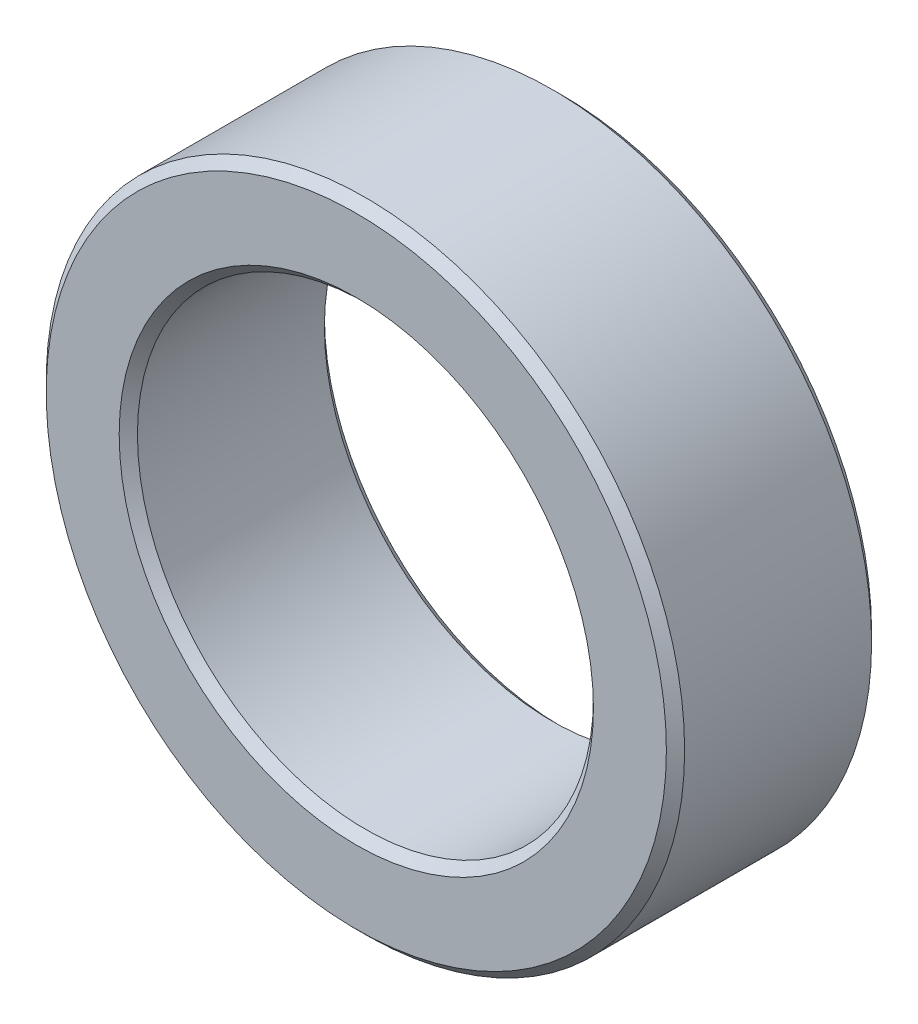
ISO-10303-21;
HEADER;
FILE_DESCRIPTION(('STEP AP214'),'2;1');
FILE_NAME('part.step','',(''),(''),'','','');
FILE_SCHEMA(('AUTOMOTIVE_DESIGN { 1 0 10303 214 1 1 1 1 }'));
ENDSEC;
DATA;
#1=APPLICATION_CONTEXT('core data for automotive mechanical design processes');
#2=APPLICATION_PROTOCOL_DEFINITION('international standard','automotive_design',2000,#1);
#3=PRODUCT_CONTEXT('',#1,'mechanical');
#4=PRODUCT('Part','Part','',(#3));
#5=PRODUCT_RELATED_PRODUCT_CATEGORY('part','',(#4));
#6=PRODUCT_DEFINITION_FORMATION('','',#4);
#7=PRODUCT_DEFINITION_CONTEXT('part definition',#1,'design');
#8=PRODUCT_DEFINITION('design','',#6,#7);
#9=PRODUCT_DEFINITION_SHAPE('','',#8);
#10=(LENGTH_UNIT() NAMED_UNIT(*) SI_UNIT(.MILLI.,.METRE.));
#11=(NAMED_UNIT(*) PLANE_ANGLE_UNIT() SI_UNIT($,.RADIAN.));
#12=(NAMED_UNIT(*) SI_UNIT($,.STERADIAN.) SOLID_ANGLE_UNIT());
#13=UNCERTAINTY_MEASURE_WITH_UNIT(LENGTH_MEASURE(1.E-05),#10,'distance_accuracy_value','');
#14=(GEOMETRIC_REPRESENTATION_CONTEXT(3) GLOBAL_UNCERTAINTY_ASSIGNED_CONTEXT((#13)) GLOBAL_UNIT_ASSIGNED_CONTEXT((#10,
#11,#12)) REPRESENTATION_CONTEXT('',''));
#15=CARTESIAN_POINT('',(0.,0.,0.));
#16=DIRECTION('',(0.,0.,1.));
#17=DIRECTION('',(1.,0.,0.));
#18=AXIS2_PLACEMENT_3D('',#15,#16,#17);
#19=CARTESIAN_POINT('',(0.,0.,4.5));
#20=DIRECTION('',(0.,0.,1.));
#21=DIRECTION('',(1.,0.,0.));
#22=AXIS2_PLACEMENT_3D('',#19,#20,#21);
#23=PLANE('',#22);
#24=CARTESIAN_POINT('',(0.,0.,4.5));
#25=DIRECTION('',(0.,0.,1.));
#26=DIRECTION('',(1.,0.,0.));
#27=AXIS2_PLACEMENT_3D('',#24,#25,#26);
#28=CIRCLE('',#27,5.2);
#29=CARTESIAN_POINT('',(5.2,0.,4.5));
#30=VERTEX_POINT('',#29);
#31=EDGE_CURVE('E10',#30,#30,#28,.F.);
#32=ORIENTED_EDGE('',*,*,#31,.T.);
#33=EDGE_LOOP('',(#32));
#34=FACE_BOUND('',#33,.T.);
#35=CARTESIAN_POINT('',(0.,0.,4.5));
#36=DIRECTION('',(0.,0.,1.));
#37=DIRECTION('',(1.,0.,0.));
#38=AXIS2_PLACEMENT_3D('',#35,#36,#37);
#39=CIRCLE('',#38,6.8);
#40=CARTESIAN_POINT('',(6.8,0.,4.5));
#41=VERTEX_POINT('',#40);
#42=EDGE_CURVE('E21',#41,#41,#39,.T.);
#43=ORIENTED_EDGE('',*,*,#42,.T.);
#44=EDGE_LOOP('',(#43));
#45=FACE_BOUND('',#44,.T.);
#46=ADVANCED_FACE('F15',(#34,#45),#23,.T.);
#47=CARTESIAN_POINT('',(0.,0.,0.));
#48=DIRECTION('',(0.,0.,1.));
#49=DIRECTION('',(1.,0.,0.));
#50=AXIS2_PLACEMENT_3D('',#47,#48,#49);
#51=PLANE('',#50);
#52=CARTESIAN_POINT('',(0.,0.,0.));
#53=DIRECTION('',(0.,0.,1.));
#54=DIRECTION('',(1.,0.,0.));
#55=AXIS2_PLACEMENT_3D('',#52,#53,#54);
#56=CIRCLE('',#55,5.2);
#57=CARTESIAN_POINT('',(5.2,0.,0.));
#58=VERTEX_POINT('',#57);
#59=EDGE_CURVE('E25',#58,#58,#56,.T.);
#60=ORIENTED_EDGE('',*,*,#59,.T.);
#61=EDGE_LOOP('',(#60));
#62=FACE_BOUND('',#61,.T.);
#63=CARTESIAN_POINT('',(0.,0.,0.));
#64=DIRECTION('',(0.,0.,1.));
#65=DIRECTION('',(1.,0.,0.));
#66=AXIS2_PLACEMENT_3D('',#63,#64,#65);
#67=CIRCLE('',#66,6.8);
#68=CARTESIAN_POINT('',(6.8,0.,0.));
#69=VERTEX_POINT('',#68);
#70=EDGE_CURVE('E29',#69,#69,#67,.F.);
#71=ORIENTED_EDGE('',*,*,#70,.T.);
#72=EDGE_LOOP('',(#71));
#73=FACE_BOUND('',#72,.T.);
#74=ADVANCED_FACE('F66',(#62,#73),#51,.F.);
#75=CARTESIAN_POINT('',(0.,0.,4.5));
#76=DIRECTION('',(0.,0.,-1.));
#77=DIRECTION('',(-1.,0.,0.));
#78=AXIS2_PLACEMENT_3D('',#75,#76,#77);
#79=CYLINDRICAL_SURFACE('',#78,7.);
#80=CARTESIAN_POINT('',(0.,0.,0.199999999999997));
#81=DIRECTION('',(0.,0.,1.));
#82=DIRECTION('',(1.,0.,0.));
#83=AXIS2_PLACEMENT_3D('',#80,#81,#82);
#84=CIRCLE('',#83,7.);
#85=CARTESIAN_POINT('',(7.,0.,0.199999999999997));
#86=VERTEX_POINT('',#85);
#87=EDGE_CURVE('E34',#86,#86,#84,.T.);
#88=ORIENTED_EDGE('',*,*,#87,.T.);
#89=EDGE_LOOP('',(#88));
#90=FACE_BOUND('',#89,.T.);
#91=CARTESIAN_POINT('',(0.,0.,4.3));
#92=DIRECTION('',(0.,0.,1.));
#93=DIRECTION('',(1.,0.,0.));
#94=AXIS2_PLACEMENT_3D('',#91,#92,#93);
#95=CIRCLE('',#94,7.);
#96=CARTESIAN_POINT('',(7.,0.,4.3));
#97=VERTEX_POINT('',#96);
#98=EDGE_CURVE('E37',#97,#97,#95,.F.);
#99=ORIENTED_EDGE('',*,*,#98,.T.);
#100=EDGE_LOOP('',(#99));
#101=FACE_BOUND('',#100,.T.);
#102=ADVANCED_FACE('F70',(#90,#101),#79,.T.);
#103=CARTESIAN_POINT('',(0.,0.,4.5));
#104=DIRECTION('',(0.,0.,-1.));
#105=DIRECTION('',(-1.,0.,0.));
#106=AXIS2_PLACEMENT_3D('',#103,#104,#105);
#107=CYLINDRICAL_SURFACE('',#106,5.);
#108=CARTESIAN_POINT('',(0.,0.,0.200000000000001));
#109=DIRECTION('',(0.,0.,1.));
#110=DIRECTION('',(1.,0.,0.));
#111=AXIS2_PLACEMENT_3D('',#108,#109,#110);
#112=CIRCLE('',#111,5.);
#113=CARTESIAN_POINT('',(5.,0.,0.200000000000001));
#114=VERTEX_POINT('',#113);
#115=EDGE_CURVE('E40',#114,#114,#112,.F.);
#116=ORIENTED_EDGE('',*,*,#115,.T.);
#117=EDGE_LOOP('',(#116));
#118=FACE_BOUND('',#117,.T.);
#119=CARTESIAN_POINT('',(0.,0.,4.3));
#120=DIRECTION('',(0.,0.,1.));
#121=DIRECTION('',(1.,0.,0.));
#122=AXIS2_PLACEMENT_3D('',#119,#120,#121);
#123=CIRCLE('',#122,5.);
#124=CARTESIAN_POINT('',(5.,0.,4.3));
#125=VERTEX_POINT('',#124);
#126=EDGE_CURVE('E43',#125,#125,#123,.T.);
#127=ORIENTED_EDGE('',*,*,#126,.T.);
#128=EDGE_LOOP('',(#127));
#129=FACE_BOUND('',#128,.T.);
#130=ADVANCED_FACE('F47',(#118,#129),#107,.F.);
#131=CARTESIAN_POINT('',(0.,0.,0.));
#132=DIRECTION('',(0.,0.,-1.));
#133=DIRECTION('',(-1.,0.,0.));
#134=AXIS2_PLACEMENT_3D('',#131,#132,#133);
#135=CONICAL_SURFACE('',#134,5.2,0.785398163397446);
#136=ORIENTED_EDGE('',*,*,#115,.F.);
#137=EDGE_LOOP('',(#136));
#138=FACE_BOUND('',#137,.T.);
#139=ORIENTED_EDGE('',*,*,#59,.F.);
#140=EDGE_LOOP('',(#139));
#141=FACE_BOUND('',#140,.T.);
#142=ADVANCED_FACE('F62',(#138,#141),#135,.F.);
#143=CARTESIAN_POINT('',(0.,0.,0.199999999999997));
#144=DIRECTION('',(0.,0.,1.));
#145=DIRECTION('',(1.,0.,0.));
#146=AXIS2_PLACEMENT_3D('',#143,#144,#145);
#147=CONICAL_SURFACE('',#146,7.,0.785398163397453);
#148=ORIENTED_EDGE('',*,*,#70,.F.);
#149=EDGE_LOOP('',(#148));
#150=FACE_BOUND('',#149,.T.);
#151=ORIENTED_EDGE('',*,*,#87,.F.);
#152=EDGE_LOOP('',(#151));
#153=FACE_BOUND('',#152,.T.);
#154=ADVANCED_FACE('F52',(#150,#153),#147,.T.);
#155=CARTESIAN_POINT('',(0.,0.,4.3));
#156=DIRECTION('',(0.,0.,1.));
#157=DIRECTION('',(1.,0.,0.));
#158=AXIS2_PLACEMENT_3D('',#155,#156,#157);
#159=CONICAL_SURFACE('',#158,5.,0.78539816339745);
#160=ORIENTED_EDGE('',*,*,#31,.F.);
#161=EDGE_LOOP('',(#160));
#162=FACE_BOUND('',#161,.T.);
#163=ORIENTED_EDGE('',*,*,#126,.F.);
#164=EDGE_LOOP('',(#163));
#165=FACE_BOUND('',#164,.T.);
#166=ADVANCED_FACE('F49',(#162,#165),#159,.F.);
#167=CARTESIAN_POINT('',(0.,0.,4.5));
#168=DIRECTION('',(0.,0.,-1.));
#169=DIRECTION('',(-1.,0.,0.));
#170=AXIS2_PLACEMENT_3D('',#167,#168,#169);
#171=CONICAL_SURFACE('',#170,6.8,0.785398163397446);
#172=ORIENTED_EDGE('',*,*,#98,.F.);
#173=EDGE_LOOP('',(#172));
#174=FACE_BOUND('',#173,.T.);
#175=ORIENTED_EDGE('',*,*,#42,.F.);
#176=EDGE_LOOP('',(#175));
#177=FACE_BOUND('',#176,.T.);
#178=ADVANCED_FACE('F51',(#174,#177),#171,.T.);
#179=CLOSED_SHELL('',(#46,#74,#102,#130,#142,#154,#166,#178));
#180=MANIFOLD_SOLID_BREP('B1',#179);
#181=ADVANCED_BREP_SHAPE_REPRESENTATION('',(#18,#180),#14);
#182=SHAPE_DEFINITION_REPRESENTATION(#9,#181);
ENDSEC;
END-ISO-10303-21;
